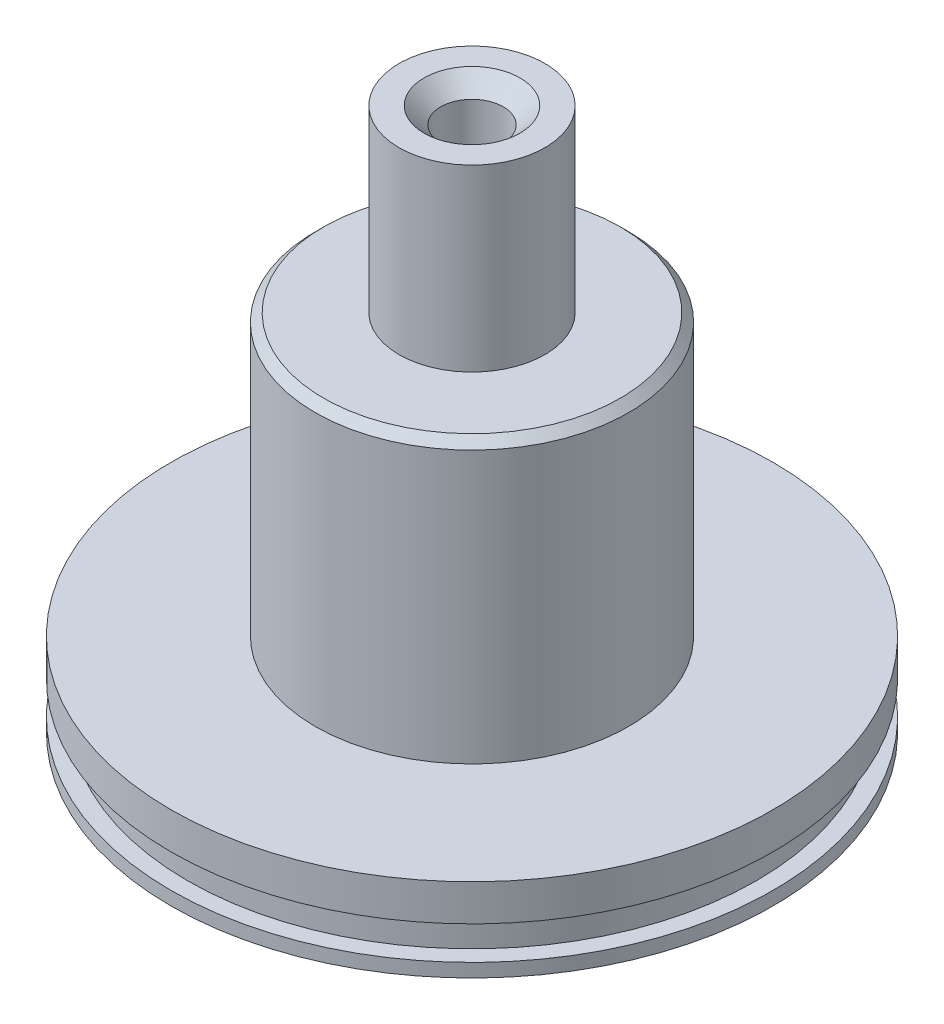
ISO-10303-21;
HEADER;
FILE_DESCRIPTION(('STEP AP214'),'2;1');
FILE_NAME('part.step','',(''),(''),'','','');
FILE_SCHEMA(('AUTOMOTIVE_DESIGN { 1 0 10303 214 1 1 1 1 }'));
ENDSEC;
DATA;
#1=APPLICATION_CONTEXT('core data for automotive mechanical design processes');
#2=APPLICATION_PROTOCOL_DEFINITION('international standard','automotive_design',2000,#1);
#3=PRODUCT_CONTEXT('',#1,'mechanical');
#4=PRODUCT('Part','Part','',(#3));
#5=PRODUCT_RELATED_PRODUCT_CATEGORY('part','',(#4));
#6=PRODUCT_DEFINITION_FORMATION('','',#4);
#7=PRODUCT_DEFINITION_CONTEXT('part definition',#1,'design');
#8=PRODUCT_DEFINITION('design','',#6,#7);
#9=PRODUCT_DEFINITION_SHAPE('','',#8);
#10=(LENGTH_UNIT() NAMED_UNIT(*) SI_UNIT(.MILLI.,.METRE.));
#11=(NAMED_UNIT(*) PLANE_ANGLE_UNIT() SI_UNIT($,.RADIAN.));
#12=(NAMED_UNIT(*) SI_UNIT($,.STERADIAN.) SOLID_ANGLE_UNIT());
#13=UNCERTAINTY_MEASURE_WITH_UNIT(LENGTH_MEASURE(1.E-05),#10,'distance_accuracy_value','');
#14=(GEOMETRIC_REPRESENTATION_CONTEXT(3) GLOBAL_UNCERTAINTY_ASSIGNED_CONTEXT((#13)) GLOBAL_UNIT_ASSIGNED_CONTEXT((#10,
#11,#12)) REPRESENTATION_CONTEXT('',''));
#15=CARTESIAN_POINT('',(0.,0.,0.));
#16=DIRECTION('',(0.,0.,1.));
#17=DIRECTION('',(1.,0.,0.));
#18=AXIS2_PLACEMENT_3D('',#15,#16,#17);
#19=CARTESIAN_POINT('',(0.,12.7,0.));
#20=DIRECTION('',(0.,-1.,0.));
#21=DIRECTION('',(0.,0.,-1.));
#22=AXIS2_PLACEMENT_3D('',#19,#20,#21);
#23=CYLINDRICAL_SURFACE('',#22,45.847);
#24=CARTESIAN_POINT('',(0.,12.7,0.));
#25=DIRECTION('',(0.,1.,0.));
#26=DIRECTION('',(0.,0.,1.));
#27=AXIS2_PLACEMENT_3D('',#24,#25,#26);
#28=CIRCLE('',#27,45.847);
#29=CARTESIAN_POINT('',(0.,12.7,45.847));
#30=VERTEX_POINT('',#29);
#31=EDGE_CURVE('E59',#30,#30,#28,.T.);
#32=ORIENTED_EDGE('',*,*,#31,.F.);
#33=EDGE_LOOP('',(#32));
#34=FACE_BOUND('',#33,.T.);
#35=CARTESIAN_POINT('',(0.,7.1374,0.));
#36=DIRECTION('',(0.,-1.,0.));
#37=DIRECTION('',(0.,0.,-1.));
#38=AXIS2_PLACEMENT_3D('',#35,#36,#37);
#39=CIRCLE('',#38,45.847);
#40=CARTESIAN_POINT('',(0.,7.1374,-45.847));
#41=VERTEX_POINT('',#40);
#42=EDGE_CURVE('E82',#41,#41,#39,.T.);
#43=ORIENTED_EDGE('',*,*,#42,.F.);
#44=EDGE_LOOP('',(#43));
#45=FACE_BOUND('',#44,.T.);
#46=ADVANCED_FACE('F39',(#34,#45),#23,.T.);
#47=CARTESIAN_POINT('',(0.,12.7,0.));
#48=DIRECTION('',(0.,1.,0.));
#49=DIRECTION('',(0.,0.,1.));
#50=AXIS2_PLACEMENT_3D('',#47,#48,#49);
#51=PLANE('',#50);
#52=CARTESIAN_POINT('',(0.,12.7,0.));
#53=DIRECTION('',(0.,1.,0.));
#54=DIRECTION('',(0.,0.,1.));
#55=AXIS2_PLACEMENT_3D('',#52,#53,#54);
#56=CIRCLE('',#55,23.876);
#57=CARTESIAN_POINT('',(0.,12.7,23.876));
#58=VERTEX_POINT('',#57);
#59=EDGE_CURVE('E63',#58,#58,#56,.T.);
#60=ORIENTED_EDGE('',*,*,#59,.F.);
#61=EDGE_LOOP('',(#60));
#62=FACE_BOUND('',#61,.T.);
#63=ORIENTED_EDGE('',*,*,#31,.T.);
#64=EDGE_LOOP('',(#63));
#65=FACE_BOUND('',#64,.T.);
#66=ADVANCED_FACE('F111',(#62,#65),#51,.T.);
#67=CARTESIAN_POINT('',(0.,55.372,0.));
#68=DIRECTION('',(0.,-1.,0.));
#69=DIRECTION('',(0.,0.,-1.));
#70=AXIS2_PLACEMENT_3D('',#67,#68,#69);
#71=CYLINDRICAL_SURFACE('',#70,23.876);
#72=CARTESIAN_POINT('',(0.,54.102,0.));
#73=DIRECTION('',(0.,1.,0.));
#74=DIRECTION('',(0.,0.,1.));
#75=AXIS2_PLACEMENT_3D('',#72,#73,#74);
#76=CIRCLE('',#75,23.876);
#77=CARTESIAN_POINT('',(0.,54.102,-23.876));
#78=VERTEX_POINT('',#77);
#79=EDGE_CURVE('E10',#78,#78,#76,.F.);
#80=ORIENTED_EDGE('',*,*,#79,.T.);
#81=EDGE_LOOP('',(#80));
#82=FACE_BOUND('',#81,.T.);
#83=ORIENTED_EDGE('',*,*,#59,.T.);
#84=EDGE_LOOP('',(#83));
#85=FACE_BOUND('',#84,.T.);
#86=ADVANCED_FACE('F118',(#82,#85),#71,.T.);
#87=CARTESIAN_POINT('',(0.,55.372,0.));
#88=DIRECTION('',(0.,1.,0.));
#89=DIRECTION('',(0.,0.,1.));
#90=AXIS2_PLACEMENT_3D('',#87,#88,#89);
#91=PLANE('',#90);
#92=CARTESIAN_POINT('',(0.,55.372,0.));
#93=DIRECTION('',(0.,1.,0.));
#94=DIRECTION('',(0.,0.,1.));
#95=AXIS2_PLACEMENT_3D('',#92,#93,#94);
#96=CIRCLE('',#95,22.606);
#97=CARTESIAN_POINT('',(0.,55.372,-22.606));
#98=VERTEX_POINT('',#97);
#99=EDGE_CURVE('E46',#98,#98,#96,.T.);
#100=ORIENTED_EDGE('',*,*,#99,.T.);
#101=EDGE_LOOP('',(#100));
#102=FACE_BOUND('',#101,.T.);
#103=CARTESIAN_POINT('',(0.,55.372,0.));
#104=DIRECTION('',(0.,1.,0.));
#105=DIRECTION('',(0.,0.,1.));
#106=AXIS2_PLACEMENT_3D('',#103,#104,#105);
#107=CIRCLE('',#106,11.1125);
#108=CARTESIAN_POINT('',(0.,55.372,11.1125));
#109=VERTEX_POINT('',#108);
#110=EDGE_CURVE('E70',#109,#109,#107,.T.);
#111=ORIENTED_EDGE('',*,*,#110,.F.);
#112=EDGE_LOOP('',(#111));
#113=FACE_BOUND('',#112,.T.);
#114=ADVANCED_FACE('F167',(#102,#113),#91,.T.);
#115=CARTESIAN_POINT('',(0.,82.677,0.));
#116=DIRECTION('',(0.,-1.,0.));
#117=DIRECTION('',(0.,0.,-1.));
#118=AXIS2_PLACEMENT_3D('',#115,#116,#117);
#119=CYLINDRICAL_SURFACE('',#118,11.1125);
#120=CARTESIAN_POINT('',(0.,82.677,0.));
#121=DIRECTION('',(0.,1.,0.));
#122=DIRECTION('',(0.,0.,1.));
#123=AXIS2_PLACEMENT_3D('',#120,#121,#122);
#124=CIRCLE('',#123,11.1125);
#125=CARTESIAN_POINT('',(0.,82.677,11.1125));
#126=VERTEX_POINT('',#125);
#127=EDGE_CURVE('E69',#126,#126,#124,.T.);
#128=ORIENTED_EDGE('',*,*,#127,.F.);
#129=EDGE_LOOP('',(#128));
#130=FACE_BOUND('',#129,.T.);
#131=ORIENTED_EDGE('',*,*,#110,.T.);
#132=EDGE_LOOP('',(#131));
#133=FACE_BOUND('',#132,.T.);
#134=ADVANCED_FACE('F163',(#130,#133),#119,.T.);
#135=CARTESIAN_POINT('',(0.,82.677,0.));
#136=DIRECTION('',(0.,1.,0.));
#137=DIRECTION('',(0.,0.,1.));
#138=AXIS2_PLACEMENT_3D('',#135,#136,#137);
#139=PLANE('',#138);
#140=CARTESIAN_POINT('',(0.,82.677,0.));
#141=DIRECTION('',(0.,1.,0.));
#142=DIRECTION('',(0.,0.,1.));
#143=AXIS2_PLACEMENT_3D('',#140,#141,#142);
#144=CIRCLE('',#143,7.30250000000002);
#145=CARTESIAN_POINT('',(0.,82.677,7.30250000000002));
#146=VERTEX_POINT('',#145);
#147=EDGE_CURVE('E50',#146,#146,#144,.F.);
#148=ORIENTED_EDGE('',*,*,#147,.T.);
#149=EDGE_LOOP('',(#148));
#150=FACE_BOUND('',#149,.T.);
#151=ORIENTED_EDGE('',*,*,#127,.T.);
#152=EDGE_LOOP('',(#151));
#153=FACE_BOUND('',#152,.T.);
#154=ADVANCED_FACE('F159',(#150,#153),#139,.T.);
#155=CARTESIAN_POINT('',(0.,57.277,0.));
#156=DIRECTION('',(0.,1.,0.));
#157=DIRECTION('',(0.,0.,1.));
#158=AXIS2_PLACEMENT_3D('',#155,#156,#157);
#159=CYLINDRICAL_SURFACE('',#158,4.7625);
#160=CARTESIAN_POINT('',(0.,80.137,0.));
#161=DIRECTION('',(0.,1.,0.));
#162=DIRECTION('',(0.,0.,1.));
#163=AXIS2_PLACEMENT_3D('',#160,#161,#162);
#164=CIRCLE('',#163,4.7625);
#165=CARTESIAN_POINT('',(0.,80.137,4.7625));
#166=VERTEX_POINT('',#165);
#167=EDGE_CURVE('E54',#166,#166,#164,.T.);
#168=ORIENTED_EDGE('',*,*,#167,.T.);
#169=EDGE_LOOP('',(#168));
#170=FACE_BOUND('',#169,.T.);
#171=CARTESIAN_POINT('',(0.,57.277,0.));
#172=DIRECTION('',(0.,1.,0.));
#173=DIRECTION('',(0.,0.,1.));
#174=AXIS2_PLACEMENT_3D('',#171,#172,#173);
#175=CIRCLE('',#174,4.7625);
#176=CARTESIAN_POINT('',(0.,57.277,4.7625));
#177=VERTEX_POINT('',#176);
#178=EDGE_CURVE('E73',#177,#177,#175,.T.);
#179=ORIENTED_EDGE('',*,*,#178,.F.);
#180=EDGE_LOOP('',(#179));
#181=FACE_BOUND('',#180,.T.);
#182=ADVANCED_FACE('F155',(#170,#181),#159,.F.);
#183=CARTESIAN_POINT('',(0.,57.277,0.));
#184=DIRECTION('',(0.,1.,0.));
#185=DIRECTION('',(0.,0.,1.));
#186=AXIS2_PLACEMENT_3D('',#183,#184,#185);
#187=PLANE('',#186);
#188=ORIENTED_EDGE('',*,*,#178,.T.);
#189=EDGE_LOOP('',(#188));
#190=FACE_BOUND('',#189,.T.);
#191=ADVANCED_FACE('F151',(#190),#187,.T.);
#192=CARTESIAN_POINT('',(0.,80.137,0.));
#193=DIRECTION('',(0.,1.,0.));
#194=DIRECTION('',(0.,0.,1.));
#195=AXIS2_PLACEMENT_3D('',#192,#193,#194);
#196=CONICAL_SURFACE('',#195,4.7625,0.785398163397451);
#197=ORIENTED_EDGE('',*,*,#147,.F.);
#198=EDGE_LOOP('',(#197));
#199=FACE_BOUND('',#198,.T.);
#200=ORIENTED_EDGE('',*,*,#167,.F.);
#201=EDGE_LOOP('',(#200));
#202=FACE_BOUND('',#201,.T.);
#203=ADVANCED_FACE('F154',(#199,#202),#196,.F.);
#204=CARTESIAN_POINT('',(0.,55.372,0.));
#205=DIRECTION('',(0.,-1.,0.));
#206=DIRECTION('',(0.,0.,-1.));
#207=AXIS2_PLACEMENT_3D('',#204,#205,#206);
#208=CONICAL_SURFACE('',#207,22.606,0.785398163397444);
#209=CARTESIAN_POINT('',(0.,54.102,-23.876));
#210=CARTESIAN_POINT('',(0.,54.1152291666667,-23.8627708333333));
#211=CARTESIAN_POINT('',(0.,54.1284583333333,-23.8495416666667));
#212=CARTESIAN_POINT('',(0.,54.1549166666667,-23.8230833333333));
#213=CARTESIAN_POINT('',(0.,54.1681458333334,-23.8098541666667));
#214=CARTESIAN_POINT('',(0.,54.1946041666667,-23.7833958333333));
#215=CARTESIAN_POINT('',(0.,54.2078333333333,-23.7701666666667));
#216=CARTESIAN_POINT('',(0.,54.2342916666667,-23.7437083333333));
#217=CARTESIAN_POINT('',(0.,54.2475208333334,-23.7304791666667));
#218=CARTESIAN_POINT('',(0.,54.2739791666667,-23.7040208333333));
#219=CARTESIAN_POINT('',(0.,54.2872083333334,-23.6907916666667));
#220=CARTESIAN_POINT('',(0.,54.3136666666667,-23.6643333333333));
#221=CARTESIAN_POINT('',(0.,54.3268958333333,-23.6511041666667));
#222=CARTESIAN_POINT('',(0.,54.3533541666667,-23.6246458333333));
#223=CARTESIAN_POINT('',(0.,54.3665833333334,-23.6114166666667));
#224=CARTESIAN_POINT('',(0.,54.3930416666667,-23.5849583333333));
#225=CARTESIAN_POINT('',(0.,54.4062708333333,-23.5717291666667));
#226=CARTESIAN_POINT('',(0.,54.4327291666667,-23.5452708333333));
#227=CARTESIAN_POINT('',(0.,54.4459583333333,-23.5320416666667));
#228=CARTESIAN_POINT('',(0.,54.4724166666667,-23.5055833333333));
#229=CARTESIAN_POINT('',(0.,54.4856458333333,-23.4923541666667));
#230=CARTESIAN_POINT('',(0.,54.5121041666667,-23.4658958333334));
#231=CARTESIAN_POINT('',(0.,54.5253333333333,-23.4526666666667));
#232=CARTESIAN_POINT('',(0.,54.5517916666667,-23.4262083333333));
#233=CARTESIAN_POINT('',(0.,54.5650208333333,-23.4129791666667));
#234=CARTESIAN_POINT('',(0.,54.5914791666667,-23.3865208333333));
#235=CARTESIAN_POINT('',(0.,54.6047083333333,-23.3732916666667));
#236=CARTESIAN_POINT('',(0.,54.6311666666667,-23.3468333333334));
#237=CARTESIAN_POINT('',(0.,54.6443958333333,-23.3336041666667));
#238=CARTESIAN_POINT('',(0.,54.6708541666667,-23.3071458333334));
#239=CARTESIAN_POINT('',(0.,54.6840833333333,-23.2939166666667));
#240=CARTESIAN_POINT('',(0.,54.7105416666667,-23.2674583333334));
#241=CARTESIAN_POINT('',(0.,54.7237708333333,-23.2542291666667));
#242=CARTESIAN_POINT('',(0.,54.7502291666667,-23.2277708333334));
#243=CARTESIAN_POINT('',(0.,54.7634583333333,-23.2145416666667));
#244=CARTESIAN_POINT('',(0.,54.7899166666667,-23.1880833333334));
#245=CARTESIAN_POINT('',(0.,54.8031458333333,-23.1748541666667));
#246=CARTESIAN_POINT('',(0.,54.8296041666667,-23.1483958333334));
#247=CARTESIAN_POINT('',(0.,54.8428333333333,-23.1351666666667));
#248=CARTESIAN_POINT('',(0.,54.8692916666667,-23.1087083333334));
#249=CARTESIAN_POINT('',(0.,54.8825208333333,-23.0954791666667));
#250=CARTESIAN_POINT('',(0.,54.9089791666667,-23.0690208333334));
#251=CARTESIAN_POINT('',(0.,54.9222083333333,-23.0557916666667));
#252=CARTESIAN_POINT('',(0.,54.9486666666667,-23.0293333333334));
#253=CARTESIAN_POINT('',(0.,54.9618958333333,-23.0161041666667));
#254=CARTESIAN_POINT('',(0.,54.9883541666667,-22.9896458333334));
#255=CARTESIAN_POINT('',(0.,55.0015833333333,-22.9764166666667));
#256=CARTESIAN_POINT('',(0.,55.0280416666667,-22.9499583333334));
#257=CARTESIAN_POINT('',(0.,55.0412708333333,-22.9367291666667));
#258=CARTESIAN_POINT('',(0.,55.0677291666667,-22.9102708333334));
#259=CARTESIAN_POINT('',(0.,55.0809583333333,-22.8970416666667));
#260=CARTESIAN_POINT('',(0.,55.1074166666667,-22.8705833333334));
#261=CARTESIAN_POINT('',(0.,55.1206458333333,-22.8573541666667));
#262=CARTESIAN_POINT('',(0.,55.1471041666667,-22.8308958333334));
#263=CARTESIAN_POINT('',(0.,55.1603333333333,-22.8176666666667));
#264=CARTESIAN_POINT('',(0.,55.1867916666667,-22.7912083333334));
#265=CARTESIAN_POINT('',(0.,55.2000208333333,-22.7779791666667));
#266=CARTESIAN_POINT('',(0.,55.2264791666667,-22.7515208333334));
#267=CARTESIAN_POINT('',(0.,55.2397083333333,-22.7382916666667));
#268=CARTESIAN_POINT('',(0.,55.2661666666667,-22.7118333333334));
#269=CARTESIAN_POINT('',(0.,55.2793958333333,-22.6986041666667));
#270=CARTESIAN_POINT('',(0.,55.3058541666667,-22.6721458333334));
#271=CARTESIAN_POINT('',(0.,55.3190833333333,-22.6589166666667));
#272=CARTESIAN_POINT('',(0.,55.3455416666667,-22.6324583333334));
#273=CARTESIAN_POINT('',(0.,55.3587708333333,-22.6192291666667));
#274=CARTESIAN_POINT('',(0.,55.372,-22.606));
#275=B_SPLINE_CURVE_WITH_KNOTS('',3,(#209,#210,#211,#212,#213,#214,#215,#216,#217,#218,#219,
#220,#221,#222,#223,#224,#225,#226,#227,#228,#229,#230,#231,#232,#233,#234,#235,#236,#237,#238,
#239,#240,#241,#242,#243,#244,#245,#246,#247,#248,#249,#250,#251,#252,#253,#254,#255,#256,#257,
#258,#259,#260,#261,#262,#263,#264,#265,#266,#267,#268,#269,#270,#271,#272,#273,#274),
.UNSPECIFIED.,.F.,.F.,(4,2,2,2,2,2,2,2,2,2,2,2,2,2,2,2,2,2,2,2,2,2,2,2,2,2,2,2,2,2,2,2,4),(0.,
0.0561266007566844,0.112253201513361,0.168379802270046,0.224506403026723,0.280633003783402,
0.336759604540087,0.392886205296764,0.449012806053443,0.505139406810127,0.561266007566804,
0.617392608323489,0.673519209080168,0.729645809836845,0.78577241059353,0.841899011350209,
0.898025612106886,0.954152212863571,1.01027881362025,1.06640541437693,1.12253201513361,
1.17865861589029,1.23478521664697,1.29091181740365,1.34703841816033,1.40316501891701,
1.45929161967369,1.51541822043038,1.57154482118705,1.62767142194373,1.68379802270042,
1.7399246234571,1.79605122421378),.UNSPECIFIED.);
#276=EDGE_CURVE('BSEAM41',#78,#98,#275,.T.);
#277=ORIENTED_EDGE('',*,*,#79,.F.);
#278=ORIENTED_EDGE('',*,*,#99,.F.);
#279=ORIENTED_EDGE('',*,*,#276,.T.);
#280=ORIENTED_EDGE('',*,*,#276,.F.);
#281=EDGE_LOOP('',(#277,#279,#278,#280));
#282=FACE_BOUND('',#281,.T.);
#283=ADVANCED_FACE('F41',(#282),#208,.T.);
#284=CARTESIAN_POINT('',(0.,7.1374,0.));
#285=DIRECTION('',(0.,-1.,0.));
#286=DIRECTION('',(0.,0.,-1.));
#287=AXIS2_PLACEMENT_3D('',#284,#285,#286);
#288=PLANE('',#287);
#289=CARTESIAN_POINT('',(0.,7.1374,0.));
#290=DIRECTION('',(0.,-1.,0.));
#291=DIRECTION('',(0.,0.,-1.));
#292=AXIS2_PLACEMENT_3D('',#289,#290,#291);
#293=CIRCLE('',#292,43.307);
#294=CARTESIAN_POINT('',(0.,7.1374,-43.307));
#295=VERTEX_POINT('',#294);
#296=EDGE_CURVE('E89',#295,#295,#293,.T.);
#297=ORIENTED_EDGE('',*,*,#296,.F.);
#298=EDGE_LOOP('',(#297));
#299=FACE_BOUND('',#298,.T.);
#300=ORIENTED_EDGE('',*,*,#42,.T.);
#301=EDGE_LOOP('',(#300));
#302=FACE_BOUND('',#301,.T.);
#303=ADVANCED_FACE('F103',(#299,#302),#288,.T.);
#304=CARTESIAN_POINT('',(0.,2.0574,0.));
#305=DIRECTION('',(0.,-1.,0.));
#306=DIRECTION('',(0.,0.,-1.));
#307=AXIS2_PLACEMENT_3D('',#304,#305,#306);
#308=PLANE('',#307);
#309=CARTESIAN_POINT('',(0.,2.0574,0.));
#310=DIRECTION('',(0.,-1.,0.));
#311=DIRECTION('',(0.,0.,-1.));
#312=AXIS2_PLACEMENT_3D('',#309,#310,#311);
#313=CIRCLE('',#312,43.307);
#314=CARTESIAN_POINT('',(0.,2.0574,-43.307));
#315=VERTEX_POINT('',#314);
#316=EDGE_CURVE('E93',#315,#315,#313,.T.);
#317=ORIENTED_EDGE('',*,*,#316,.T.);
#318=EDGE_LOOP('',(#317));
#319=FACE_BOUND('',#318,.T.);
#320=CARTESIAN_POINT('',(0.,2.0574,0.));
#321=DIRECTION('',(0.,-1.,0.));
#322=DIRECTION('',(0.,0.,-1.));
#323=AXIS2_PLACEMENT_3D('',#320,#321,#322);
#324=CIRCLE('',#323,45.847);
#325=CARTESIAN_POINT('',(0.,2.0574,-45.847));
#326=VERTEX_POINT('',#325);
#327=EDGE_CURVE('E85',#326,#326,#324,.T.);
#328=ORIENTED_EDGE('',*,*,#327,.F.);
#329=EDGE_LOOP('',(#328));
#330=FACE_BOUND('',#329,.T.);
#331=ADVANCED_FACE('F106',(#319,#330),#308,.F.);
#332=CARTESIAN_POINT('',(0.,7.1374,0.));
#333=DIRECTION('',(0.,-1.,0.));
#334=DIRECTION('',(0.,0.,-1.));
#335=AXIS2_PLACEMENT_3D('',#332,#333,#334);
#336=CYLINDRICAL_SURFACE('',#335,43.307);
#337=ORIENTED_EDGE('',*,*,#296,.T.);
#338=EDGE_LOOP('',(#337));
#339=FACE_BOUND('',#338,.T.);
#340=ORIENTED_EDGE('',*,*,#316,.F.);
#341=EDGE_LOOP('',(#340));
#342=FACE_BOUND('',#341,.T.);
#343=ADVANCED_FACE('F100',(#339,#342),#336,.T.);
#344=CARTESIAN_POINT('',(0.,50.8,0.));
#345=DIRECTION('',(0.,-1.,0.));
#346=DIRECTION('',(0.,0.,-1.));
#347=AXIS2_PLACEMENT_3D('',#344,#345,#346);
#348=PLANE('',#347);
#349=CARTESIAN_POINT('',(0.,50.8,0.));
#350=DIRECTION('',(0.,-1.,0.));
#351=DIRECTION('',(0.,0.,-1.));
#352=AXIS2_PLACEMENT_3D('',#349,#350,#351);
#353=CIRCLE('',#352,19.05);
#354=CARTESIAN_POINT('',(0.,50.8,-19.05));
#355=VERTEX_POINT('',#354);
#356=EDGE_CURVE('E78',#355,#355,#353,.T.);
#357=ORIENTED_EDGE('',*,*,#356,.T.);
#358=EDGE_LOOP('',(#357));
#359=FACE_BOUND('',#358,.T.);
#360=ADVANCED_FACE('F142',(#359),#348,.T.);
#361=CARTESIAN_POINT('',(0.,50.8,0.));
#362=DIRECTION('',(0.,-1.,0.));
#363=DIRECTION('',(0.,0.,-1.));
#364=AXIS2_PLACEMENT_3D('',#361,#362,#363);
#365=CYLINDRICAL_SURFACE('',#364,19.05);
#366=ORIENTED_EDGE('',*,*,#356,.F.);
#367=EDGE_LOOP('',(#366));
#368=FACE_BOUND('',#367,.T.);
#369=CARTESIAN_POINT('',(0.,0.,0.));
#370=DIRECTION('',(0.,-1.,0.));
#371=DIRECTION('',(0.,0.,-1.));
#372=AXIS2_PLACEMENT_3D('',#369,#370,#371);
#373=CIRCLE('',#372,19.05);
#374=CARTESIAN_POINT('',(0.,0.,-19.05));
#375=VERTEX_POINT('',#374);
#376=EDGE_CURVE('E79',#375,#375,#373,.T.);
#377=ORIENTED_EDGE('',*,*,#376,.T.);
#378=EDGE_LOOP('',(#377));
#379=FACE_BOUND('',#378,.T.);
#380=ADVANCED_FACE('F129',(#368,#379),#365,.F.);
#381=CARTESIAN_POINT('',(0.,0.,0.));
#382=DIRECTION('',(0.,1.,0.));
#383=DIRECTION('',(0.,0.,1.));
#384=AXIS2_PLACEMENT_3D('',#381,#382,#383);
#385=PLANE('',#384);
#386=ORIENTED_EDGE('',*,*,#376,.F.);
#387=EDGE_LOOP('',(#386));
#388=FACE_BOUND('',#387,.T.);
#389=CARTESIAN_POINT('',(0.,0.,0.));
#390=DIRECTION('',(0.,1.,0.));
#391=DIRECTION('',(0.,0.,1.));
#392=AXIS2_PLACEMENT_3D('',#389,#390,#391);
#393=CIRCLE('',#392,45.847);
#394=CARTESIAN_POINT('',(0.,0.,45.847));
#395=VERTEX_POINT('',#394);
#396=EDGE_CURVE('E60',#395,#395,#393,.T.);
#397=ORIENTED_EDGE('',*,*,#396,.F.);
#398=EDGE_LOOP('',(#397));
#399=FACE_BOUND('',#398,.T.);
#400=ADVANCED_FACE('F124',(#388,#399),#385,.F.);
#401=ORIENTED_EDGE('',*,*,#327,.T.);
#402=EDGE_LOOP('',(#401));
#403=FACE_BOUND('',#402,.T.);
#404=ORIENTED_EDGE('',*,*,#396,.T.);
#405=EDGE_LOOP('',(#404));
#406=FACE_BOUND('',#405,.T.);
#407=ADVANCED_FACE('F114',(#403,#406),#23,.T.);
#408=CLOSED_SHELL('',(#46,#66,#86,#114,#134,#154,#182,#191,#203,#283,#303,#331,#343,#360,#380,
#400,#407));
#409=MANIFOLD_SOLID_BREP('B2',#408);
#410=ADVANCED_BREP_SHAPE_REPRESENTATION('',(#18,#409),#14);
#411=SHAPE_DEFINITION_REPRESENTATION(#9,#410);
ENDSEC;
END-ISO-10303-21;
